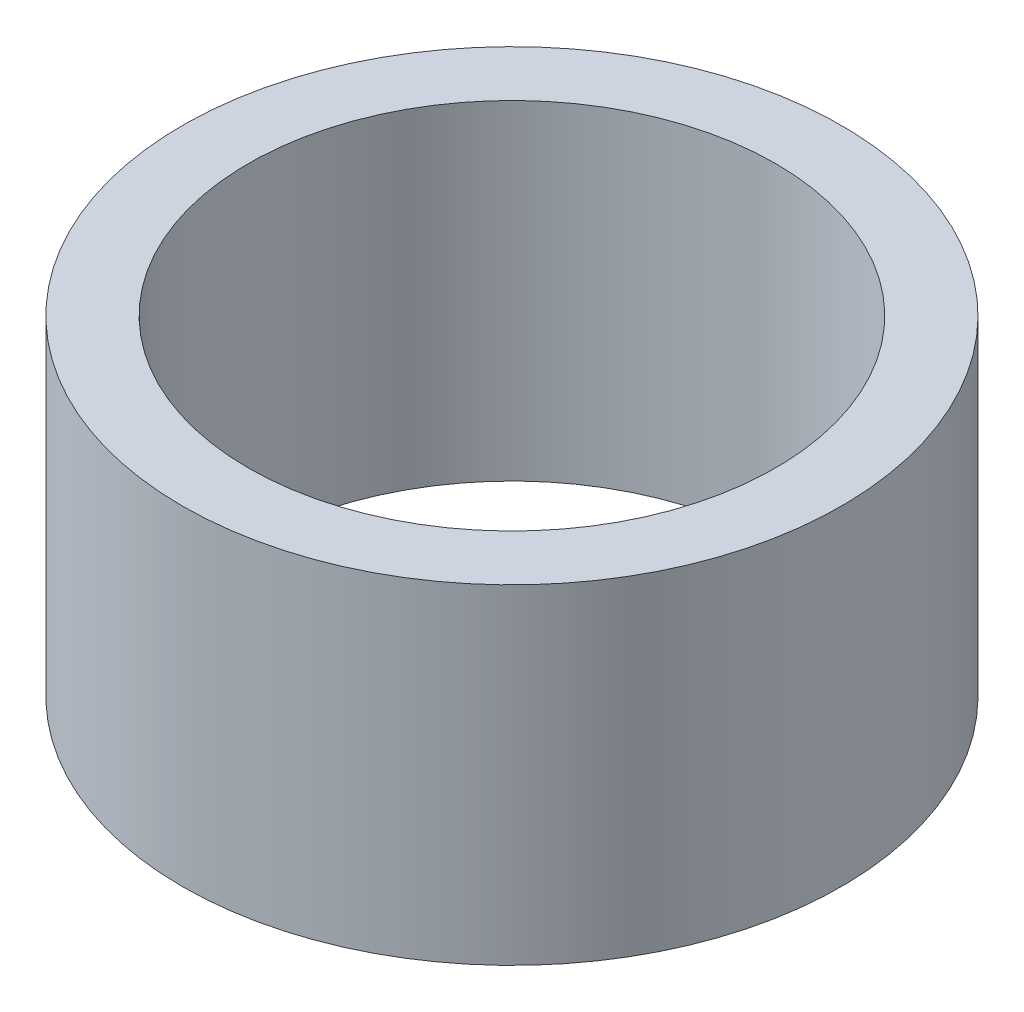
ISO-10303-21;
HEADER;
FILE_DESCRIPTION(('STEP AP214'),'2;1');
FILE_NAME('part.step','',(''),(''),'','','');
FILE_SCHEMA(('AUTOMOTIVE_DESIGN { 1 0 10303 214 1 1 1 1 }'));
ENDSEC;
DATA;
#1=APPLICATION_CONTEXT('core data for automotive mechanical design processes');
#2=APPLICATION_PROTOCOL_DEFINITION('international standard','automotive_design',2000,#1);
#3=PRODUCT_CONTEXT('',#1,'mechanical');
#4=PRODUCT('Part','Part','',(#3));
#5=PRODUCT_RELATED_PRODUCT_CATEGORY('part','',(#4));
#6=PRODUCT_DEFINITION_FORMATION('','',#4);
#7=PRODUCT_DEFINITION_CONTEXT('part definition',#1,'design');
#8=PRODUCT_DEFINITION('design','',#6,#7);
#9=PRODUCT_DEFINITION_SHAPE('','',#8);
#10=(LENGTH_UNIT() NAMED_UNIT(*) SI_UNIT(.MILLI.,.METRE.));
#11=(NAMED_UNIT(*) PLANE_ANGLE_UNIT() SI_UNIT($,.RADIAN.));
#12=(NAMED_UNIT(*) SI_UNIT($,.STERADIAN.) SOLID_ANGLE_UNIT());
#13=UNCERTAINTY_MEASURE_WITH_UNIT(LENGTH_MEASURE(1.E-05),#10,'distance_accuracy_value','');
#14=(GEOMETRIC_REPRESENTATION_CONTEXT(3) GLOBAL_UNCERTAINTY_ASSIGNED_CONTEXT((#13)) GLOBAL_UNIT_ASSIGNED_CONTEXT((#10,
#11,#12)) REPRESENTATION_CONTEXT('',''));
#15=CARTESIAN_POINT('',(0.,0.,0.));
#16=DIRECTION('',(0.,0.,1.));
#17=DIRECTION('',(1.,0.,0.));
#18=AXIS2_PLACEMENT_3D('',#15,#16,#17);
#19=CARTESIAN_POINT('',(5.0035,0.003500000000031,5.0035));
#20=DIRECTION('',(0.,1.,0.));
#21=DIRECTION('',(0.,0.,1.));
#22=AXIS2_PLACEMENT_3D('',#19,#20,#21);
#23=CYLINDRICAL_SURFACE('',#22,4.);
#24=CARTESIAN_POINT('',(5.0035,0.003500000000031,5.0035));
#25=DIRECTION('',(0.,1.,0.));
#26=DIRECTION('',(0.,0.,1.));
#27=AXIS2_PLACEMENT_3D('',#24,#25,#26);
#28=CIRCLE('',#27,4.);
#29=CARTESIAN_POINT('',(5.0035,0.003500000000031,9.0035));
#30=VERTEX_POINT('',#29);
#31=EDGE_CURVE('E25',#30,#30,#28,.F.);
#32=ORIENTED_EDGE('',*,*,#31,.T.);
#33=EDGE_LOOP('',(#32));
#34=FACE_BOUND('',#33,.T.);
#35=CARTESIAN_POINT('',(5.0035,5.0035,5.0035));
#36=DIRECTION('',(0.,1.,0.));
#37=DIRECTION('',(0.,0.,1.));
#38=AXIS2_PLACEMENT_3D('',#35,#36,#37);
#39=CIRCLE('',#38,4.);
#40=CARTESIAN_POINT('',(5.0035,5.0035,9.0035));
#41=VERTEX_POINT('',#40);
#42=EDGE_CURVE('E16',#41,#41,#39,.F.);
#43=ORIENTED_EDGE('',*,*,#42,.F.);
#44=EDGE_LOOP('',(#43));
#45=FACE_BOUND('',#44,.T.);
#46=ADVANCED_FACE('F13',(#34,#45),#23,.F.);
#47=CARTESIAN_POINT('',(5.0035,5.0035,5.0035));
#48=DIRECTION('',(0.,1.,0.));
#49=DIRECTION('',(0.,0.,1.));
#50=AXIS2_PLACEMENT_3D('',#47,#48,#49);
#51=PLANE('',#50);
#52=ORIENTED_EDGE('',*,*,#42,.T.);
#53=EDGE_LOOP('',(#52));
#54=FACE_BOUND('',#53,.T.);
#55=CARTESIAN_POINT('',(5.0035,5.0035,5.0035));
#56=DIRECTION('',(0.,1.,0.));
#57=DIRECTION('',(0.,0.,1.));
#58=AXIS2_PLACEMENT_3D('',#55,#56,#57);
#59=CIRCLE('',#58,5.);
#60=CARTESIAN_POINT('',(5.0035,5.0035,10.0035));
#61=VERTEX_POINT('',#60);
#62=EDGE_CURVE('E20',#61,#61,#59,.F.);
#63=ORIENTED_EDGE('',*,*,#62,.F.);
#64=EDGE_LOOP('',(#63));
#65=FACE_BOUND('',#64,.T.);
#66=ADVANCED_FACE('F33',(#54,#65),#51,.T.);
#67=CARTESIAN_POINT('',(5.0035,0.003500000000031,5.0035));
#68=DIRECTION('',(0.,1.,0.));
#69=DIRECTION('',(0.,0.,1.));
#70=AXIS2_PLACEMENT_3D('',#67,#68,#69);
#71=PLANE('',#70);
#72=ORIENTED_EDGE('',*,*,#31,.F.);
#73=EDGE_LOOP('',(#72));
#74=FACE_BOUND('',#73,.T.);
#75=CARTESIAN_POINT('',(5.0035,0.003500000000031,5.0035));
#76=DIRECTION('',(0.,1.,0.));
#77=DIRECTION('',(0.,0.,1.));
#78=AXIS2_PLACEMENT_3D('',#75,#76,#77);
#79=CIRCLE('',#78,5.);
#80=CARTESIAN_POINT('',(5.0035,0.003500000000031,10.0035));
#81=VERTEX_POINT('',#80);
#82=EDGE_CURVE('E8',#81,#81,#79,.T.);
#83=ORIENTED_EDGE('',*,*,#82,.F.);
#84=EDGE_LOOP('',(#83));
#85=FACE_BOUND('',#84,.T.);
#86=ADVANCED_FACE('F41',(#74,#85),#71,.F.);
#87=CARTESIAN_POINT('',(5.0035,0.003500000000031,5.0035));
#88=DIRECTION('',(0.,1.,0.));
#89=DIRECTION('',(0.,0.,1.));
#90=AXIS2_PLACEMENT_3D('',#87,#88,#89);
#91=CYLINDRICAL_SURFACE('',#90,5.);
#92=ORIENTED_EDGE('',*,*,#82,.T.);
#93=EDGE_LOOP('',(#92));
#94=FACE_BOUND('',#93,.T.);
#95=ORIENTED_EDGE('',*,*,#62,.T.);
#96=EDGE_LOOP('',(#95));
#97=FACE_BOUND('',#96,.T.);
#98=ADVANCED_FACE('F42',(#94,#97),#91,.T.);
#99=CLOSED_SHELL('',(#46,#66,#86,#98));
#100=MANIFOLD_SOLID_BREP('B1',#99);
#101=ADVANCED_BREP_SHAPE_REPRESENTATION('',(#18,#100),#14);
#102=SHAPE_DEFINITION_REPRESENTATION(#9,#101);
ENDSEC;
END-ISO-10303-21;
